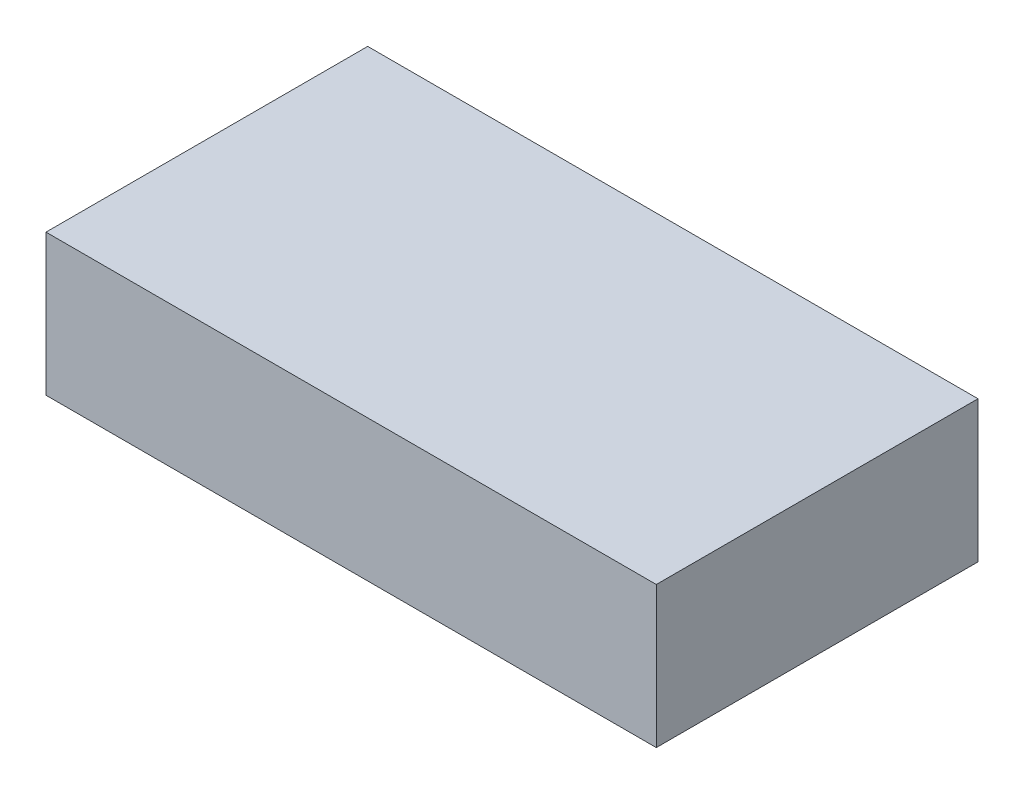
ISO-10303-21;
HEADER;
FILE_DESCRIPTION(('STEP AP214'),'2;1');
FILE_NAME('part.step','',(''),(''),'','','');
FILE_SCHEMA(('AUTOMOTIVE_DESIGN { 1 0 10303 214 1 1 1 1 }'));
ENDSEC;
DATA;
#1=APPLICATION_CONTEXT('core data for automotive mechanical design processes');
#2=APPLICATION_PROTOCOL_DEFINITION('international standard','automotive_design',2000,#1);
#3=PRODUCT_CONTEXT('',#1,'mechanical');
#4=PRODUCT('Part','Part','',(#3));
#5=PRODUCT_RELATED_PRODUCT_CATEGORY('part','',(#4));
#6=PRODUCT_DEFINITION_FORMATION('','',#4);
#7=PRODUCT_DEFINITION_CONTEXT('part definition',#1,'design');
#8=PRODUCT_DEFINITION('design','',#6,#7);
#9=PRODUCT_DEFINITION_SHAPE('','',#8);
#10=(LENGTH_UNIT() NAMED_UNIT(*) SI_UNIT(.MILLI.,.METRE.));
#11=(NAMED_UNIT(*) PLANE_ANGLE_UNIT() SI_UNIT($,.RADIAN.));
#12=(NAMED_UNIT(*) SI_UNIT($,.STERADIAN.) SOLID_ANGLE_UNIT());
#13=UNCERTAINTY_MEASURE_WITH_UNIT(LENGTH_MEASURE(1.E-05),#10,'distance_accuracy_value','');
#14=(GEOMETRIC_REPRESENTATION_CONTEXT(3) GLOBAL_UNCERTAINTY_ASSIGNED_CONTEXT((#13)) GLOBAL_UNIT_ASSIGNED_CONTEXT((#10,
#11,#12)) REPRESENTATION_CONTEXT('',''));
#15=CARTESIAN_POINT('',(0.,0.,0.));
#16=DIRECTION('',(0.,0.,1.));
#17=DIRECTION('',(1.,0.,0.));
#18=AXIS2_PLACEMENT_3D('',#15,#16,#17);
#19=CARTESIAN_POINT('',(10.14949202,-2.34949238,0.));
#20=DIRECTION('',(0.,-1.,0.));
#21=DIRECTION('',(0.,0.,-1.));
#22=AXIS2_PLACEMENT_3D('',#19,#20,#21);
#23=PLANE('',#22);
#24=DIRECTION('',(0.,0.,1.));
#25=VECTOR('',#24,1.);
#26=CARTESIAN_POINT('',(-10.14949202,-2.34949238,0.));
#27=LINE('',#26,#25);
#28=CARTESIAN_POINT('',(-10.14949202,-2.34949238,0.));
#29=VERTEX_POINT('',#28);
#30=CARTESIAN_POINT('',(-10.14949202,-2.34949238,10.69999892));
#31=VERTEX_POINT('',#30);
#32=EDGE_CURVE('E20',#29,#31,#27,.T.);
#33=ORIENTED_EDGE('',*,*,#32,.F.);
#34=DIRECTION('',(1.,0.,0.));
#35=VECTOR('',#34,1.);
#36=CARTESIAN_POINT('',(-10.14949202,-2.34949238,0.));
#37=LINE('',#36,#35);
#38=CARTESIAN_POINT('',(10.14949202,-2.34949238,0.));
#39=VERTEX_POINT('',#38);
#40=EDGE_CURVE('E79',#29,#39,#37,.T.);
#41=ORIENTED_EDGE('',*,*,#40,.T.);
#42=DIRECTION('',(0.,0.,-1.));
#43=VECTOR('',#42,1.);
#44=CARTESIAN_POINT('',(10.14949202,-2.34949238,0.));
#45=LINE('',#44,#43);
#46=CARTESIAN_POINT('',(10.14949202,-2.34949238,10.69999892));
#47=VERTEX_POINT('',#46);
#48=EDGE_CURVE('E61',#47,#39,#45,.T.);
#49=ORIENTED_EDGE('',*,*,#48,.F.);
#50=DIRECTION('',(1.,0.,0.));
#51=VECTOR('',#50,1.);
#52=CARTESIAN_POINT('',(-10.14949202,-2.34949238,10.69999892));
#53=LINE('',#52,#51);
#54=EDGE_CURVE('E56',#31,#47,#53,.T.);
#55=ORIENTED_EDGE('',*,*,#54,.F.);
#56=EDGE_LOOP('',(#33,#41,#49,#55));
#57=FACE_BOUND('',#56,.T.);
#58=ADVANCED_FACE('F17',(#57),#23,.T.);
#59=CARTESIAN_POINT('',(-10.14949202,-2.34949238,0.));
#60=DIRECTION('',(-1.,0.,0.));
#61=DIRECTION('',(0.,0.,1.));
#62=AXIS2_PLACEMENT_3D('',#59,#60,#61);
#63=PLANE('',#62);
#64=DIRECTION('',(0.,0.,1.));
#65=VECTOR('',#64,1.);
#66=CARTESIAN_POINT('',(-10.14949202,2.34949238,0.));
#67=LINE('',#66,#65);
#68=CARTESIAN_POINT('',(-10.14949202,2.34949238,0.));
#69=VERTEX_POINT('',#68);
#70=CARTESIAN_POINT('',(-10.14949202,2.34949238,10.69999892));
#71=VERTEX_POINT('',#70);
#72=EDGE_CURVE('E83',#69,#71,#67,.T.);
#73=ORIENTED_EDGE('',*,*,#72,.F.);
#74=DIRECTION('',(0.,1.,0.));
#75=VECTOR('',#74,1.);
#76=CARTESIAN_POINT('',(-10.14949202,-2.34949238,0.));
#77=LINE('',#76,#75);
#78=EDGE_CURVE('E68',#69,#29,#77,.F.);
#79=ORIENTED_EDGE('',*,*,#78,.T.);
#80=ORIENTED_EDGE('',*,*,#32,.T.);
#81=DIRECTION('',(0.,1.,0.));
#82=VECTOR('',#81,1.);
#83=CARTESIAN_POINT('',(-10.14949202,-2.34949238,10.69999892));
#84=LINE('',#83,#82);
#85=EDGE_CURVE('E63',#71,#31,#84,.F.);
#86=ORIENTED_EDGE('',*,*,#85,.F.);
#87=EDGE_LOOP('',(#73,#79,#80,#86));
#88=FACE_BOUND('',#87,.T.);
#89=ADVANCED_FACE('F65',(#88),#63,.T.);
#90=CARTESIAN_POINT('',(-10.14949202,-2.34949238,10.69999892));
#91=DIRECTION('',(0.,0.,1.));
#92=DIRECTION('',(1.,0.,0.));
#93=AXIS2_PLACEMENT_3D('',#90,#91,#92);
#94=PLANE('',#93);
#95=DIRECTION('',(1.,0.,0.));
#96=VECTOR('',#95,1.);
#97=CARTESIAN_POINT('',(-10.14949202,2.34949238,10.69999892));
#98=LINE('',#97,#96);
#99=CARTESIAN_POINT('',(10.14949202,2.34949238,10.69999892));
#100=VERTEX_POINT('',#99);
#101=EDGE_CURVE('E72',#71,#100,#98,.T.);
#102=ORIENTED_EDGE('',*,*,#101,.F.);
#103=ORIENTED_EDGE('',*,*,#85,.T.);
#104=ORIENTED_EDGE('',*,*,#54,.T.);
#105=DIRECTION('',(0.,1.,0.));
#106=VECTOR('',#105,1.);
#107=CARTESIAN_POINT('',(10.14949202,2.34949238,10.69999892));
#108=LINE('',#107,#106);
#109=EDGE_CURVE('E74',#100,#47,#108,.F.);
#110=ORIENTED_EDGE('',*,*,#109,.F.);
#111=EDGE_LOOP('',(#102,#103,#104,#110));
#112=FACE_BOUND('',#111,.T.);
#113=ADVANCED_FACE('F70',(#112),#94,.T.);
#114=CARTESIAN_POINT('',(10.14949202,2.34949238,0.));
#115=DIRECTION('',(1.,0.,0.));
#116=DIRECTION('',(0.,0.,-1.));
#117=AXIS2_PLACEMENT_3D('',#114,#115,#116);
#118=PLANE('',#117);
#119=ORIENTED_EDGE('',*,*,#48,.T.);
#120=DIRECTION('',(0.,1.,0.));
#121=VECTOR('',#120,1.);
#122=CARTESIAN_POINT('',(10.14949202,-2.34949238,0.));
#123=LINE('',#122,#121);
#124=CARTESIAN_POINT('',(10.14949202,2.34949238,0.));
#125=VERTEX_POINT('',#124);
#126=EDGE_CURVE('E35',#39,#125,#123,.T.);
#127=ORIENTED_EDGE('',*,*,#126,.T.);
#128=DIRECTION('',(0.,0.,1.));
#129=VECTOR('',#128,1.);
#130=CARTESIAN_POINT('',(10.14949202,2.34949238,0.));
#131=LINE('',#130,#129);
#132=EDGE_CURVE('E26',#100,#125,#131,.F.);
#133=ORIENTED_EDGE('',*,*,#132,.F.);
#134=ORIENTED_EDGE('',*,*,#109,.T.);
#135=EDGE_LOOP('',(#119,#127,#133,#134));
#136=FACE_BOUND('',#135,.T.);
#137=ADVANCED_FACE('F89',(#136),#118,.T.);
#138=CARTESIAN_POINT('',(-10.14949202,-2.34949238,0.));
#139=DIRECTION('',(0.,0.,1.));
#140=DIRECTION('',(1.,0.,0.));
#141=AXIS2_PLACEMENT_3D('',#138,#139,#140);
#142=PLANE('',#141);
#143=DIRECTION('',(1.,0.,0.));
#144=VECTOR('',#143,1.);
#145=CARTESIAN_POINT('',(-10.14949202,2.34949238,0.));
#146=LINE('',#145,#144);
#147=EDGE_CURVE('E11',#125,#69,#146,.F.);
#148=ORIENTED_EDGE('',*,*,#147,.F.);
#149=ORIENTED_EDGE('',*,*,#126,.F.);
#150=ORIENTED_EDGE('',*,*,#40,.F.);
#151=ORIENTED_EDGE('',*,*,#78,.F.);
#152=EDGE_LOOP('',(#148,#149,#150,#151));
#153=FACE_BOUND('',#152,.T.);
#154=ADVANCED_FACE('F91',(#153),#142,.F.);
#155=CARTESIAN_POINT('',(-10.14949202,2.34949238,0.));
#156=DIRECTION('',(0.,1.,0.));
#157=DIRECTION('',(0.,0.,1.));
#158=AXIS2_PLACEMENT_3D('',#155,#156,#157);
#159=PLANE('',#158);
#160=ORIENTED_EDGE('',*,*,#132,.T.);
#161=ORIENTED_EDGE('',*,*,#147,.T.);
#162=ORIENTED_EDGE('',*,*,#72,.T.);
#163=ORIENTED_EDGE('',*,*,#101,.T.);
#164=EDGE_LOOP('',(#160,#161,#162,#163));
#165=FACE_BOUND('',#164,.T.);
#166=ADVANCED_FACE('F88',(#165),#159,.T.);
#167=CLOSED_SHELL('',(#58,#89,#113,#137,#154,#166));
#168=MANIFOLD_SOLID_BREP('B1',#167);
#169=ADVANCED_BREP_SHAPE_REPRESENTATION('',(#18,#168),#14);
#170=SHAPE_DEFINITION_REPRESENTATION(#9,#169);
ENDSEC;
END-ISO-10303-21;
